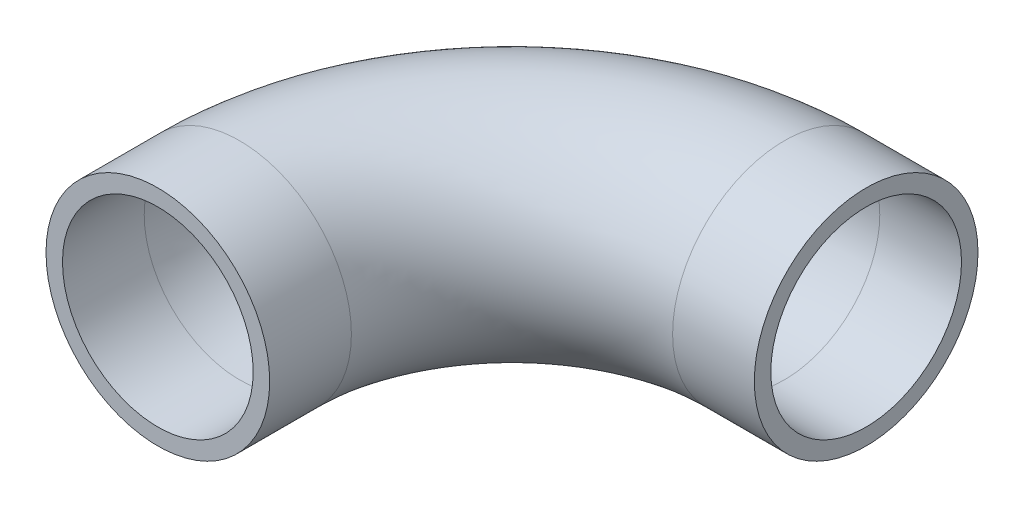
ISO-10303-21;
HEADER;
FILE_DESCRIPTION(('STEP AP214'),'2;1');
FILE_NAME('part.step','',(''),(''),'','','');
FILE_SCHEMA(('AUTOMOTIVE_DESIGN { 1 0 10303 214 1 1 1 1 }'));
ENDSEC;
DATA;
#1=APPLICATION_CONTEXT('core data for automotive mechanical design processes');
#2=APPLICATION_PROTOCOL_DEFINITION('international standard','automotive_design',2000,#1);
#3=PRODUCT_CONTEXT('',#1,'mechanical');
#4=PRODUCT('Part','Part','',(#3));
#5=PRODUCT_RELATED_PRODUCT_CATEGORY('part','',(#4));
#6=PRODUCT_DEFINITION_FORMATION('','',#4);
#7=PRODUCT_DEFINITION_CONTEXT('part definition',#1,'design');
#8=PRODUCT_DEFINITION('design','',#6,#7);
#9=PRODUCT_DEFINITION_SHAPE('','',#8);
#10=(LENGTH_UNIT() NAMED_UNIT(*) SI_UNIT(.MILLI.,.METRE.));
#11=(NAMED_UNIT(*) PLANE_ANGLE_UNIT() SI_UNIT($,.RADIAN.));
#12=(NAMED_UNIT(*) SI_UNIT($,.STERADIAN.) SOLID_ANGLE_UNIT());
#13=UNCERTAINTY_MEASURE_WITH_UNIT(LENGTH_MEASURE(1.E-05),#10,'distance_accuracy_value','');
#14=(GEOMETRIC_REPRESENTATION_CONTEXT(3) GLOBAL_UNCERTAINTY_ASSIGNED_CONTEXT((#13)) GLOBAL_UNIT_ASSIGNED_CONTEXT((#10,
#11,#12)) REPRESENTATION_CONTEXT('',''));
#15=CARTESIAN_POINT('',(0.,0.,0.));
#16=DIRECTION('',(0.,0.,1.));
#17=DIRECTION('',(1.,0.,0.));
#18=AXIS2_PLACEMENT_3D('',#15,#16,#17);
#19=CARTESIAN_POINT('',(0.,0.,0.));
#20=DIRECTION('',(0.,0.,-1.));
#21=DIRECTION('',(-1.,0.,0.));
#22=AXIS2_PLACEMENT_3D('',#19,#20,#21);
#23=CYLINDRICAL_SURFACE('',#22,8.21);
#24=CARTESIAN_POINT('',(0.,0.,-6.));
#25=DIRECTION('',(0.,0.,1.));
#26=DIRECTION('',(1.,0.,0.));
#27=AXIS2_PLACEMENT_3D('',#24,#25,#26);
#28=CIRCLE('',#27,8.21);
#29=CARTESIAN_POINT('',(-8.21,0.,-6.));
#30=VERTEX_POINT('',#29);
#31=EDGE_CURVE('E70',#30,#30,#28,.T.);
#32=ORIENTED_EDGE('',*,*,#31,.T.);
#33=EDGE_LOOP('',(#32));
#34=FACE_BOUND('',#33,.T.);
#35=CARTESIAN_POINT('',(0.,0.,0.));
#36=DIRECTION('',(0.,0.,1.));
#37=DIRECTION('',(1.,0.,0.));
#38=AXIS2_PLACEMENT_3D('',#35,#36,#37);
#39=CIRCLE('',#38,8.21);
#40=CARTESIAN_POINT('',(8.21,0.,0.));
#41=VERTEX_POINT('',#40);
#42=EDGE_CURVE('E67',#41,#41,#39,.T.);
#43=ORIENTED_EDGE('',*,*,#42,.F.);
#44=EDGE_LOOP('',(#43));
#45=FACE_BOUND('',#44,.T.);
#46=ADVANCED_FACE('F43',(#34,#45),#23,.T.);
#47=CARTESIAN_POINT('',(20.,0.,-6.));
#48=DIRECTION('',(0.,-1.,0.));
#49=DIRECTION('',(0.,0.,-1.));
#50=AXIS2_PLACEMENT_3D('',#47,#48,#49);
#51=TOROIDAL_SURFACE('',#50,20.,8.21);
#52=CARTESIAN_POINT('',(20.,0.,-26.));
#53=DIRECTION('',(-1.,0.,0.));
#54=DIRECTION('',(0.,0.,1.));
#55=AXIS2_PLACEMENT_3D('',#52,#53,#54);
#56=CIRCLE('',#55,8.21);
#57=CARTESIAN_POINT('',(20.,0.,-34.21));
#58=VERTEX_POINT('',#57);
#59=EDGE_CURVE('E47',#58,#58,#56,.T.);
#60=CARTESIAN_POINT('',(20.,0.,-6.));
#61=DIRECTION('',(0.,-1.,0.));
#62=DIRECTION('',(0.,0.,-1.));
#63=AXIS2_PLACEMENT_3D('',#60,#61,#62);
#64=CIRCLE('',#63,28.21);
#65=EDGE_CURVE('',#30,#58,#64,.T.);
#66=ORIENTED_EDGE('',*,*,#31,.F.);
#67=ORIENTED_EDGE('',*,*,#59,.T.);
#68=ORIENTED_EDGE('',*,*,#65,.T.);
#69=ORIENTED_EDGE('',*,*,#65,.F.);
#70=EDGE_LOOP('',(#66,#68,#67,#69));
#71=FACE_BOUND('',#70,.T.);
#72=ADVANCED_FACE('F79',(#71),#51,.T.);
#73=CARTESIAN_POINT('',(20.,0.,-26.));
#74=DIRECTION('',(1.,0.,0.));
#75=DIRECTION('',(0.,0.,-1.));
#76=AXIS2_PLACEMENT_3D('',#73,#74,#75);
#77=CYLINDRICAL_SURFACE('',#76,8.21);
#78=CARTESIAN_POINT('',(26.,0.,-26.));
#79=DIRECTION('',(-1.,0.,0.));
#80=DIRECTION('',(0.,0.,1.));
#81=AXIS2_PLACEMENT_3D('',#78,#79,#80);
#82=CIRCLE('',#81,8.21);
#83=CARTESIAN_POINT('',(26.,0.,-17.79));
#84=VERTEX_POINT('',#83);
#85=EDGE_CURVE('E62',#84,#84,#82,.T.);
#86=ORIENTED_EDGE('',*,*,#85,.T.);
#87=EDGE_LOOP('',(#86));
#88=FACE_BOUND('',#87,.T.);
#89=ORIENTED_EDGE('',*,*,#59,.F.);
#90=EDGE_LOOP('',(#89));
#91=FACE_BOUND('',#90,.T.);
#92=ADVANCED_FACE('F45',(#88,#91),#77,.T.);
#93=CARTESIAN_POINT('',(0.,0.,0.));
#94=DIRECTION('',(0.,0.,1.));
#95=DIRECTION('',(1.,0.,0.));
#96=AXIS2_PLACEMENT_3D('',#93,#94,#95);
#97=PLANE('',#96);
#98=CARTESIAN_POINT('',(0.,0.,0.));
#99=DIRECTION('',(0.,0.,1.));
#100=DIRECTION('',(1.,0.,0.));
#101=AXIS2_PLACEMENT_3D('',#98,#99,#100);
#102=CIRCLE('',#101,7.);
#103=CARTESIAN_POINT('',(7.,0.,0.));
#104=VERTEX_POINT('',#103);
#105=EDGE_CURVE('E66',#104,#104,#102,.F.);
#106=ORIENTED_EDGE('',*,*,#105,.T.);
#107=EDGE_LOOP('',(#106));
#108=FACE_BOUND('',#107,.T.);
#109=ORIENTED_EDGE('',*,*,#42,.T.);
#110=EDGE_LOOP('',(#109));
#111=FACE_BOUND('',#110,.T.);
#112=ADVANCED_FACE('F83',(#108,#111),#97,.T.);
#113=CARTESIAN_POINT('',(26.,0.,-26.));
#114=DIRECTION('',(-1.,0.,0.));
#115=DIRECTION('',(0.,0.,1.));
#116=AXIS2_PLACEMENT_3D('',#113,#114,#115);
#117=PLANE('',#116);
#118=CARTESIAN_POINT('',(26.,0.,-26.));
#119=DIRECTION('',(-1.,0.,0.));
#120=DIRECTION('',(0.,0.,1.));
#121=AXIS2_PLACEMENT_3D('',#118,#119,#120);
#122=CIRCLE('',#121,7.);
#123=CARTESIAN_POINT('',(26.,0.,-19.));
#124=VERTEX_POINT('',#123);
#125=EDGE_CURVE('E10',#124,#124,#122,.F.);
#126=ORIENTED_EDGE('',*,*,#125,.F.);
#127=EDGE_LOOP('',(#126));
#128=FACE_BOUND('',#127,.T.);
#129=ORIENTED_EDGE('',*,*,#85,.F.);
#130=EDGE_LOOP('',(#129));
#131=FACE_BOUND('',#130,.T.);
#132=ADVANCED_FACE('F89',(#128,#131),#117,.F.);
#133=CARTESIAN_POINT('',(0.,0.,0.));
#134=DIRECTION('',(0.,0.,-1.));
#135=DIRECTION('',(-1.,0.,0.));
#136=AXIS2_PLACEMENT_3D('',#133,#134,#135);
#137=CYLINDRICAL_SURFACE('',#136,7.);
#138=CARTESIAN_POINT('',(0.,0.,-6.));
#139=DIRECTION('',(0.,0.,1.));
#140=DIRECTION('',(1.,0.,0.));
#141=AXIS2_PLACEMENT_3D('',#138,#139,#140);
#142=CIRCLE('',#141,7.);
#143=CARTESIAN_POINT('',(-7.,0.,-6.));
#144=VERTEX_POINT('',#143);
#145=EDGE_CURVE('E58',#144,#144,#142,.F.);
#146=ORIENTED_EDGE('',*,*,#145,.T.);
#147=EDGE_LOOP('',(#146));
#148=FACE_BOUND('',#147,.T.);
#149=ORIENTED_EDGE('',*,*,#105,.F.);
#150=EDGE_LOOP('',(#149));
#151=FACE_BOUND('',#150,.T.);
#152=ADVANCED_FACE('F99',(#148,#151),#137,.F.);
#153=CARTESIAN_POINT('',(20.,0.,-6.));
#154=DIRECTION('',(0.,-1.,0.));
#155=DIRECTION('',(0.,0.,-1.));
#156=AXIS2_PLACEMENT_3D('',#153,#154,#155);
#157=TOROIDAL_SURFACE('',#156,20.,7.);
#158=CARTESIAN_POINT('',(20.,0.,-26.));
#159=DIRECTION('',(-1.,0.,0.));
#160=DIRECTION('',(0.,0.,1.));
#161=AXIS2_PLACEMENT_3D('',#158,#159,#160);
#162=CIRCLE('',#161,7.);
#163=CARTESIAN_POINT('',(20.,0.,-33.));
#164=VERTEX_POINT('',#163);
#165=EDGE_CURVE('E52',#164,#164,#162,.F.);
#166=CARTESIAN_POINT('',(20.,0.,-6.));
#167=DIRECTION('',(0.,-1.,0.));
#168=DIRECTION('',(0.,0.,-1.));
#169=AXIS2_PLACEMENT_3D('',#166,#167,#168);
#170=CIRCLE('',#169,27.);
#171=EDGE_CURVE('',#144,#164,#170,.T.);
#172=ORIENTED_EDGE('',*,*,#145,.F.);
#173=ORIENTED_EDGE('',*,*,#165,.T.);
#174=ORIENTED_EDGE('',*,*,#171,.T.);
#175=ORIENTED_EDGE('',*,*,#171,.F.);
#176=EDGE_LOOP('',(#172,#174,#173,#175));
#177=FACE_BOUND('',#176,.T.);
#178=ADVANCED_FACE('F94',(#177),#157,.F.);
#179=CARTESIAN_POINT('',(20.,0.,-26.));
#180=DIRECTION('',(1.,0.,0.));
#181=DIRECTION('',(0.,0.,-1.));
#182=AXIS2_PLACEMENT_3D('',#179,#180,#181);
#183=CYLINDRICAL_SURFACE('',#182,7.);
#184=ORIENTED_EDGE('',*,*,#125,.T.);
#185=EDGE_LOOP('',(#184));
#186=FACE_BOUND('',#185,.T.);
#187=ORIENTED_EDGE('',*,*,#165,.F.);
#188=EDGE_LOOP('',(#187));
#189=FACE_BOUND('',#188,.T.);
#190=ADVANCED_FACE('F92',(#186,#189),#183,.F.);
#191=CLOSED_SHELL('',(#46,#72,#92,#112,#132,#152,#178,#190));
#192=MANIFOLD_SOLID_BREP('B2',#191);
#193=ADVANCED_BREP_SHAPE_REPRESENTATION('',(#18,#192),#14);
#194=SHAPE_DEFINITION_REPRESENTATION(#9,#193);
ENDSEC;
END-ISO-10303-21;
